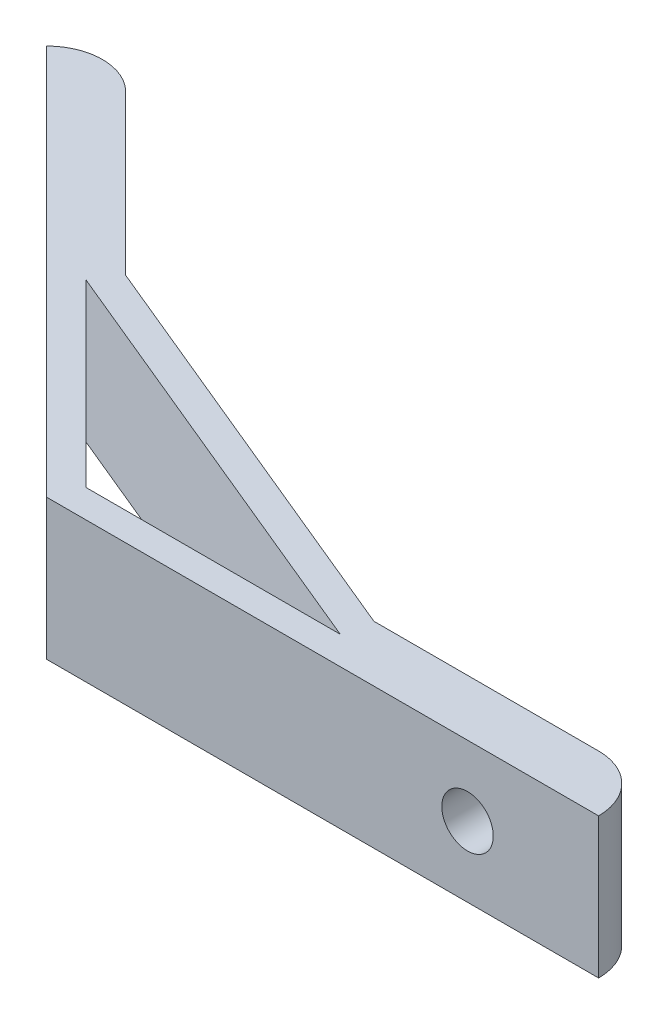
ISO-10303-21;
HEADER;
FILE_DESCRIPTION(('STEP AP214'),'2;1');
FILE_NAME('part.step','',(''),(''),'','','');
FILE_SCHEMA(('AUTOMOTIVE_DESIGN { 1 0 10303 214 1 1 1 1 }'));
ENDSEC;
DATA;
#1=APPLICATION_CONTEXT('core data for automotive mechanical design processes');
#2=APPLICATION_PROTOCOL_DEFINITION('international standard','automotive_design',2000,#1);
#3=PRODUCT_CONTEXT('',#1,'mechanical');
#4=PRODUCT('Part','Part','',(#3));
#5=PRODUCT_RELATED_PRODUCT_CATEGORY('part','',(#4));
#6=PRODUCT_DEFINITION_FORMATION('','',#4);
#7=PRODUCT_DEFINITION_CONTEXT('part definition',#1,'design');
#8=PRODUCT_DEFINITION('design','',#6,#7);
#9=PRODUCT_DEFINITION_SHAPE('','',#8);
#10=(LENGTH_UNIT() NAMED_UNIT(*) SI_UNIT(.MILLI.,.METRE.));
#11=(NAMED_UNIT(*) PLANE_ANGLE_UNIT() SI_UNIT($,.RADIAN.));
#12=(NAMED_UNIT(*) SI_UNIT($,.STERADIAN.) SOLID_ANGLE_UNIT());
#13=UNCERTAINTY_MEASURE_WITH_UNIT(LENGTH_MEASURE(1.E-05),#10,'distance_accuracy_value','');
#14=(GEOMETRIC_REPRESENTATION_CONTEXT(3) GLOBAL_UNCERTAINTY_ASSIGNED_CONTEXT((#13)) GLOBAL_UNIT_ASSIGNED_CONTEXT((#10,
#11,#12)) REPRESENTATION_CONTEXT('',''));
#15=CARTESIAN_POINT('',(0.,0.,0.));
#16=DIRECTION('',(0.,0.,1.));
#17=DIRECTION('',(1.,0.,0.));
#18=AXIS2_PLACEMENT_3D('',#15,#16,#17);
#19=CARTESIAN_POINT('',(-30.,15.,-6.));
#20=DIRECTION('',(0.,0.,1.));
#21=DIRECTION('',(1.,0.,0.));
#22=AXIS2_PLACEMENT_3D('',#19,#20,#21);
#23=PLANE('',#22);
#24=CARTESIAN_POINT('',(-14.,7.5,-6.));
#25=DIRECTION('',(0.,0.,-1.));
#26=DIRECTION('',(-1.,0.,0.));
#27=AXIS2_PLACEMENT_3D('',#24,#25,#26);
#28=CIRCLE('',#27,2.75);
#29=CARTESIAN_POINT('',(-16.75,7.5,-6.));
#30=VERTEX_POINT('',#29);
#31=EDGE_CURVE('E140',#30,#30,#28,.T.);
#32=ORIENTED_EDGE('',*,*,#31,.F.);
#33=EDGE_LOOP('',(#32));
#34=FACE_BOUND('',#33,.T.);
#35=DIRECTION('',(-1.,0.,0.));
#36=VECTOR('',#35,1.);
#37=CARTESIAN_POINT('',(-30.,15.,-6.));
#38=LINE('',#37,#36);
#39=CARTESIAN_POINT('',(-6.,15.,-6.));
#40=VERTEX_POINT('',#39);
#41=CARTESIAN_POINT('',(-30.,15.,-6.));
#42=VERTEX_POINT('',#41);
#43=EDGE_CURVE('E151',#40,#42,#38,.T.);
#44=ORIENTED_EDGE('',*,*,#43,.F.);
#45=DIRECTION('',(0.,-1.,0.));
#46=VECTOR('',#45,1.);
#47=CARTESIAN_POINT('',(-6.,15.,-6.));
#48=LINE('',#47,#46);
#49=CARTESIAN_POINT('',(-6.,0.,-6.));
#50=VERTEX_POINT('',#49);
#51=EDGE_CURVE('E11',#40,#50,#48,.T.);
#52=ORIENTED_EDGE('',*,*,#51,.T.);
#53=DIRECTION('',(-1.,0.,0.));
#54=VECTOR('',#53,1.);
#55=CARTESIAN_POINT('',(-30.,0.,-6.));
#56=LINE('',#55,#54);
#57=CARTESIAN_POINT('',(-30.,0.,-6.));
#58=VERTEX_POINT('',#57);
#59=EDGE_CURVE('E149',#50,#58,#56,.T.);
#60=ORIENTED_EDGE('',*,*,#59,.T.);
#61=DIRECTION('',(0.,-1.,0.));
#62=VECTOR('',#61,1.);
#63=CARTESIAN_POINT('',(-30.,15.,-6.));
#64=LINE('',#63,#62);
#65=EDGE_CURVE('E185',#42,#58,#64,.T.);
#66=ORIENTED_EDGE('',*,*,#65,.F.);
#67=EDGE_LOOP('',(#44,#52,#60,#66));
#68=FACE_BOUND('',#67,.T.);
#69=ADVANCED_FACE('F41',(#34,#68),#23,.F.);
#70=CARTESIAN_POINT('',(-75.2634559672905,15.,-24.7487373415292));
#71=DIRECTION('',(-0.382683432365091,0.,0.923879532511287));
#72=DIRECTION('',(0.923879532511287,0.,0.382683432365091));
#73=AXIS2_PLACEMENT_3D('',#70,#71,#72);
#74=PLANE('',#73);
#75=DIRECTION('',(-0.923879532511286,0.,-0.382683432365091));
#76=VECTOR('',#75,1.);
#77=CARTESIAN_POINT('',(-75.2634559672905,0.,-24.7487373415292));
#78=LINE('',#77,#76);
#79=CARTESIAN_POINT('',(-75.2634559672905,0.,-24.7487373415292));
#80=VERTEX_POINT('',#79);
#81=EDGE_CURVE('E165',#58,#80,#78,.T.);
#82=ORIENTED_EDGE('',*,*,#81,.T.);
#83=DIRECTION('',(0.,-1.,0.));
#84=VECTOR('',#83,1.);
#85=CARTESIAN_POINT('',(-75.2634559672905,15.,-24.7487373415292));
#86=LINE('',#85,#84);
#87=CARTESIAN_POINT('',(-75.2634559672905,15.,-24.7487373415292));
#88=VERTEX_POINT('',#87);
#89=EDGE_CURVE('E182',#88,#80,#86,.T.);
#90=ORIENTED_EDGE('',*,*,#89,.F.);
#91=DIRECTION('',(-0.923879532511286,0.,-0.382683432365091));
#92=VECTOR('',#91,1.);
#93=CARTESIAN_POINT('',(-75.2634559672905,15.,-24.7487373415292));
#94=LINE('',#93,#92);
#95=EDGE_CURVE('E153',#42,#88,#94,.T.);
#96=ORIENTED_EDGE('',*,*,#95,.F.);
#97=ORIENTED_EDGE('',*,*,#65,.T.);
#98=EDGE_LOOP('',(#82,#90,#96,#97));
#99=FACE_BOUND('',#98,.T.);
#100=ADVANCED_FACE('F218',(#99),#74,.F.);
#101=CARTESIAN_POINT('',(-96.4766594028869,15.,-45.9619407771256));
#102=DIRECTION('',(-0.707106781186549,0.,0.707106781186546));
#103=DIRECTION('',(0.707106781186546,0.,0.707106781186549));
#104=AXIS2_PLACEMENT_3D('',#101,#102,#103);
#105=PLANE('',#104);
#106=CARTESIAN_POINT('',(-86.5771644662753,7.5,-36.062445840514));
#107=DIRECTION('',(0.707106781186549,0.,-0.707106781186546));
#108=DIRECTION('',(-0.707106781186546,0.,-0.707106781186549));
#109=AXIS2_PLACEMENT_3D('',#106,#107,#108);
#110=CIRCLE('',#109,2.75000000000002);
#111=CARTESIAN_POINT('',(-88.5217081145383,7.5,-38.006989488777));
#112=VERTEX_POINT('',#111);
#113=EDGE_CURVE('E278',#112,#112,#110,.T.);
#114=ORIENTED_EDGE('',*,*,#113,.F.);
#115=EDGE_LOOP('',(#114));
#116=FACE_BOUND('',#115,.T.);
#117=DIRECTION('',(-0.707106781186546,0.,-0.707106781186548));
#118=VECTOR('',#117,1.);
#119=CARTESIAN_POINT('',(-96.4766594028869,0.,-45.9619407771256));
#120=LINE('',#119,#118);
#121=CARTESIAN_POINT('',(-92.2340187157677,0.,-41.7193000900063));
#122=VERTEX_POINT('',#121);
#123=EDGE_CURVE('E167',#80,#122,#120,.T.);
#124=ORIENTED_EDGE('',*,*,#123,.T.);
#125=DIRECTION('',(0.,-1.,0.));
#126=VECTOR('',#125,1.);
#127=CARTESIAN_POINT('',(-92.2340187157677,15.,-41.7193000900063));
#128=LINE('',#127,#126);
#129=CARTESIAN_POINT('',(-92.2340187157677,15.,-41.7193000900063));
#130=VERTEX_POINT('',#129);
#131=EDGE_CURVE('E192',#122,#130,#128,.F.);
#132=ORIENTED_EDGE('',*,*,#131,.T.);
#133=DIRECTION('',(-0.707106781186546,0.,-0.707106781186548));
#134=VECTOR('',#133,1.);
#135=CARTESIAN_POINT('',(-96.4766594028869,15.,-45.9619407771256));
#136=LINE('',#135,#134);
#137=EDGE_CURVE('E156',#88,#130,#136,.T.);
#138=ORIENTED_EDGE('',*,*,#137,.F.);
#139=ORIENTED_EDGE('',*,*,#89,.T.);
#140=EDGE_LOOP('',(#124,#132,#138,#139));
#141=FACE_BOUND('',#140,.T.);
#142=ADVANCED_FACE('F214',(#116,#141),#105,.F.);
#143=CARTESIAN_POINT('',(-59.,15.,0.));
#144=DIRECTION('',(0.707106781186549,0.,-0.707106781186547));
#145=DIRECTION('',(-0.707106781186547,0.,-0.707106781186549));
#146=AXIS2_PLACEMENT_3D('',#143,#144,#145);
#147=PLANE('',#146);
#148=CARTESIAN_POINT('',(-90.8198051533946,7.5,-31.8198051533947));
#149=DIRECTION('',(0.707106781186549,0.,-0.707106781186547));
#150=DIRECTION('',(-0.707106781186547,0.,-0.707106781186549));
#151=AXIS2_PLACEMENT_3D('',#148,#149,#150);
#152=CIRCLE('',#151,2.75000000000002);
#153=CARTESIAN_POINT('',(-92.7643488016576,7.5,-33.7643488016577));
#154=VERTEX_POINT('',#153);
#155=EDGE_CURVE('E45',#154,#154,#152,.T.);
#156=ORIENTED_EDGE('',*,*,#155,.T.);
#157=EDGE_LOOP('',(#156));
#158=FACE_BOUND('',#157,.T.);
#159=DIRECTION('',(0.707106781186547,0.,0.707106781186549));
#160=VECTOR('',#159,1.);
#161=CARTESIAN_POINT('',(-59.,0.,0.));
#162=LINE('',#161,#160);
#163=CARTESIAN_POINT('',(-100.719300090006,0.,-41.7193000900064));
#164=VERTEX_POINT('',#163);
#165=CARTESIAN_POINT('',(-59.,0.,0.));
#166=VERTEX_POINT('',#165);
#167=EDGE_CURVE('E170',#164,#166,#162,.T.);
#168=ORIENTED_EDGE('',*,*,#167,.T.);
#169=DIRECTION('',(0.,-1.,0.));
#170=VECTOR('',#169,1.);
#171=CARTESIAN_POINT('',(-59.,15.,0.));
#172=LINE('',#171,#170);
#173=CARTESIAN_POINT('',(-59.,15.,0.));
#174=VERTEX_POINT('',#173);
#175=EDGE_CURVE('E176',#174,#166,#172,.T.);
#176=ORIENTED_EDGE('',*,*,#175,.F.);
#177=DIRECTION('',(0.707106781186547,0.,0.707106781186549));
#178=VECTOR('',#177,1.);
#179=CARTESIAN_POINT('',(-59.,15.,0.));
#180=LINE('',#179,#178);
#181=CARTESIAN_POINT('',(-100.719300090006,15.,-41.7193000900064));
#182=VERTEX_POINT('',#181);
#183=EDGE_CURVE('E159',#182,#174,#180,.T.);
#184=ORIENTED_EDGE('',*,*,#183,.F.);
#185=DIRECTION('',(0.,-1.,0.));
#186=VECTOR('',#185,1.);
#187=CARTESIAN_POINT('',(-100.719300090006,15.,-41.7193000900064));
#188=LINE('',#187,#186);
#189=EDGE_CURVE('E179',#182,#164,#188,.T.);
#190=ORIENTED_EDGE('',*,*,#189,.T.);
#191=EDGE_LOOP('',(#168,#176,#184,#190));
#192=FACE_BOUND('',#191,.T.);
#193=ADVANCED_FACE('F206',(#158,#192),#147,.F.);
#194=CARTESIAN_POINT('',(0.,15.,0.));
#195=DIRECTION('',(0.,0.,-1.));
#196=DIRECTION('',(-1.,0.,0.));
#197=AXIS2_PLACEMENT_3D('',#194,#195,#196);
#198=PLANE('',#197);
#199=CARTESIAN_POINT('',(-14.,7.5,0.));
#200=DIRECTION('',(0.,0.,-1.));
#201=DIRECTION('',(-1.,0.,0.));
#202=AXIS2_PLACEMENT_3D('',#199,#200,#201);
#203=CIRCLE('',#202,2.75);
#204=CARTESIAN_POINT('',(-16.75,7.5,0.));
#205=VERTEX_POINT('',#204);
#206=EDGE_CURVE('E145',#205,#205,#203,.T.);
#207=ORIENTED_EDGE('',*,*,#206,.T.);
#208=EDGE_LOOP('',(#207));
#209=FACE_BOUND('',#208,.T.);
#210=DIRECTION('',(1.,0.,0.));
#211=VECTOR('',#210,1.);
#212=CARTESIAN_POINT('',(0.,0.,0.));
#213=LINE('',#212,#211);
#214=CARTESIAN_POINT('',(0.,0.,0.));
#215=VERTEX_POINT('',#214);
#216=EDGE_CURVE('E154',#166,#215,#213,.T.);
#217=ORIENTED_EDGE('',*,*,#216,.T.);
#218=DIRECTION('',(0.,-1.,0.));
#219=VECTOR('',#218,1.);
#220=CARTESIAN_POINT('',(0.,15.,0.));
#221=LINE('',#220,#219);
#222=CARTESIAN_POINT('',(0.,15.,0.));
#223=VERTEX_POINT('',#222);
#224=EDGE_CURVE('E163',#223,#215,#221,.T.);
#225=ORIENTED_EDGE('',*,*,#224,.F.);
#226=DIRECTION('',(1.,0.,0.));
#227=VECTOR('',#226,1.);
#228=CARTESIAN_POINT('',(0.,15.,0.));
#229=LINE('',#228,#227);
#230=EDGE_CURVE('E161',#174,#223,#229,.T.);
#231=ORIENTED_EDGE('',*,*,#230,.F.);
#232=ORIENTED_EDGE('',*,*,#175,.T.);
#233=EDGE_LOOP('',(#217,#225,#231,#232));
#234=FACE_BOUND('',#233,.T.);
#235=ADVANCED_FACE('F228',(#209,#234),#198,.F.);
#236=CARTESIAN_POINT('',(0.,15.,0.));
#237=DIRECTION('',(0.,-1.,0.));
#238=DIRECTION('',(0.,0.,-1.));
#239=AXIS2_PLACEMENT_3D('',#236,#237,#238);
#240=PLANE('',#239);
#241=DIRECTION('',(1.,0.,0.));
#242=VECTOR('',#241,1.);
#243=CARTESIAN_POINT('',(-30.596737102139,15.,-3.));
#244=LINE('',#243,#242);
#245=CARTESIAN_POINT('',(-57.7573593128806,15.,-3.));
#246=VERTEX_POINT('',#245);
#247=CARTESIAN_POINT('',(-30.596737102139,15.,-3.));
#248=VERTEX_POINT('',#247);
#249=EDGE_CURVE('E137',#246,#248,#244,.T.);
#250=ORIENTED_EDGE('',*,*,#249,.F.);
#251=DIRECTION('',(0.707106781186548,0.,0.707106781186547));
#252=VECTOR('',#251,1.);
#253=CARTESIAN_POINT('',(-57.7573593128806,15.,-3.));
#254=LINE('',#253,#252);
#255=CARTESIAN_POINT('',(-76.962819459342,15.,-22.2054601464614));
#256=VERTEX_POINT('',#255);
#257=EDGE_CURVE('E57',#256,#246,#254,.T.);
#258=ORIENTED_EDGE('',*,*,#257,.F.);
#259=DIRECTION('',(-0.923879532511286,0.,-0.38268343236509));
#260=VECTOR('',#259,1.);
#261=CARTESIAN_POINT('',(-76.962819459342,15.,-22.2054601464614));
#262=LINE('',#261,#260);
#263=EDGE_CURVE('E134',#248,#256,#262,.T.);
#264=ORIENTED_EDGE('',*,*,#263,.F.);
#265=EDGE_LOOP('',(#250,#258,#264));
#266=FACE_BOUND('',#265,.T.);
#267=ORIENTED_EDGE('',*,*,#137,.T.);
#268=CARTESIAN_POINT('',(-96.476659402887,15.,-37.4766594028871));
#269=DIRECTION('',(0.,-1.,0.));
#270=DIRECTION('',(0.,0.,-1.));
#271=AXIS2_PLACEMENT_3D('',#268,#269,#270);
#272=CIRCLE('',#271,6.);
#273=EDGE_CURVE('E50',#130,#182,#272,.F.);
#274=ORIENTED_EDGE('',*,*,#273,.T.);
#275=ORIENTED_EDGE('',*,*,#183,.T.);
#276=ORIENTED_EDGE('',*,*,#230,.T.);
#277=CARTESIAN_POINT('',(-6.,15.,0.));
#278=DIRECTION('',(0.,-1.,0.));
#279=DIRECTION('',(0.,0.,-1.));
#280=AXIS2_PLACEMENT_3D('',#277,#278,#279);
#281=CIRCLE('',#280,6.);
#282=EDGE_CURVE('E194',#223,#40,#281,.F.);
#283=ORIENTED_EDGE('',*,*,#282,.T.);
#284=ORIENTED_EDGE('',*,*,#43,.T.);
#285=ORIENTED_EDGE('',*,*,#95,.T.);
#286=EDGE_LOOP('',(#267,#274,#275,#276,#283,#284,#285));
#287=FACE_BOUND('',#286,.T.);
#288=ADVANCED_FACE('F199',(#266,#287),#240,.F.);
#289=CARTESIAN_POINT('',(0.,0.,0.));
#290=DIRECTION('',(0.,-1.,0.));
#291=DIRECTION('',(0.,0.,-1.));
#292=AXIS2_PLACEMENT_3D('',#289,#290,#291);
#293=PLANE('',#292);
#294=DIRECTION('',(0.707106781186548,0.,0.707106781186547));
#295=VECTOR('',#294,1.);
#296=CARTESIAN_POINT('',(-57.7573593128806,0.,-3.));
#297=LINE('',#296,#295);
#298=CARTESIAN_POINT('',(-76.962819459342,0.,-22.2054601464614));
#299=VERTEX_POINT('',#298);
#300=CARTESIAN_POINT('',(-57.7573593128806,0.,-3.));
#301=VERTEX_POINT('',#300);
#302=EDGE_CURVE('E121',#299,#301,#297,.T.);
#303=ORIENTED_EDGE('',*,*,#302,.T.);
#304=DIRECTION('',(1.,0.,0.));
#305=VECTOR('',#304,1.);
#306=CARTESIAN_POINT('',(-30.596737102139,0.,-3.));
#307=LINE('',#306,#305);
#308=CARTESIAN_POINT('',(-30.596737102139,0.,-3.));
#309=VERTEX_POINT('',#308);
#310=EDGE_CURVE('E128',#301,#309,#307,.T.);
#311=ORIENTED_EDGE('',*,*,#310,.T.);
#312=DIRECTION('',(-0.923879532511286,0.,-0.38268343236509));
#313=VECTOR('',#312,1.);
#314=CARTESIAN_POINT('',(-76.962819459342,0.,-22.2054601464614));
#315=LINE('',#314,#313);
#316=EDGE_CURVE('E65',#309,#299,#315,.T.);
#317=ORIENTED_EDGE('',*,*,#316,.T.);
#318=EDGE_LOOP('',(#303,#311,#317));
#319=FACE_BOUND('',#318,.T.);
#320=ORIENTED_EDGE('',*,*,#167,.F.);
#321=CARTESIAN_POINT('',(-96.476659402887,0.,-37.4766594028871));
#322=DIRECTION('',(0.,-1.,0.));
#323=DIRECTION('',(0.,0.,-1.));
#324=AXIS2_PLACEMENT_3D('',#321,#322,#323);
#325=CIRCLE('',#324,6.);
#326=EDGE_CURVE('E190',#164,#122,#325,.T.);
#327=ORIENTED_EDGE('',*,*,#326,.T.);
#328=ORIENTED_EDGE('',*,*,#123,.F.);
#329=ORIENTED_EDGE('',*,*,#81,.F.);
#330=ORIENTED_EDGE('',*,*,#59,.F.);
#331=CARTESIAN_POINT('',(-6.,0.,0.));
#332=DIRECTION('',(0.,-1.,0.));
#333=DIRECTION('',(0.,0.,-1.));
#334=AXIS2_PLACEMENT_3D('',#331,#332,#333);
#335=CIRCLE('',#334,6.);
#336=EDGE_CURVE('E188',#50,#215,#335,.T.);
#337=ORIENTED_EDGE('',*,*,#336,.T.);
#338=ORIENTED_EDGE('',*,*,#216,.F.);
#339=EDGE_LOOP('',(#320,#327,#328,#329,#330,#337,#338));
#340=FACE_BOUND('',#339,.T.);
#341=ADVANCED_FACE('F132',(#319,#340),#293,.T.);
#342=CARTESIAN_POINT('',(-96.476659402887,15.,-37.4766594028871));
#343=DIRECTION('',(0.,-1.,0.));
#344=DIRECTION('',(0.,0.,-1.));
#345=AXIS2_PLACEMENT_3D('',#342,#343,#344);
#346=CYLINDRICAL_SURFACE('',#345,6.);
#347=ORIENTED_EDGE('',*,*,#273,.F.);
#348=ORIENTED_EDGE('',*,*,#131,.F.);
#349=ORIENTED_EDGE('',*,*,#326,.F.);
#350=ORIENTED_EDGE('',*,*,#189,.F.);
#351=EDGE_LOOP('',(#347,#348,#349,#350));
#352=FACE_BOUND('',#351,.T.);
#353=ADVANCED_FACE('F209',(#352),#346,.T.);
#354=CARTESIAN_POINT('',(-6.,15.,0.));
#355=DIRECTION('',(0.,-1.,0.));
#356=DIRECTION('',(0.,0.,-1.));
#357=AXIS2_PLACEMENT_3D('',#354,#355,#356);
#358=CYLINDRICAL_SURFACE('',#357,6.);
#359=ORIENTED_EDGE('',*,*,#282,.F.);
#360=ORIENTED_EDGE('',*,*,#224,.T.);
#361=ORIENTED_EDGE('',*,*,#336,.F.);
#362=ORIENTED_EDGE('',*,*,#51,.F.);
#363=EDGE_LOOP('',(#359,#360,#361,#362));
#364=FACE_BOUND('',#363,.T.);
#365=ADVANCED_FACE('F43',(#364),#358,.T.);
#366=CARTESIAN_POINT('',(-57.7573593128806,0.,-3.));
#367=DIRECTION('',(-0.707106781186547,0.,0.707106781186548));
#368=DIRECTION('',(0.707106781186548,0.,0.707106781186547));
#369=AXIS2_PLACEMENT_3D('',#366,#367,#368);
#370=PLANE('',#369);
#371=ORIENTED_EDGE('',*,*,#257,.T.);
#372=DIRECTION('',(0.,1.,0.));
#373=VECTOR('',#372,1.);
#374=CARTESIAN_POINT('',(-57.7573593128806,0.,-3.));
#375=LINE('',#374,#373);
#376=EDGE_CURVE('E117',#301,#246,#375,.T.);
#377=ORIENTED_EDGE('',*,*,#376,.F.);
#378=ORIENTED_EDGE('',*,*,#302,.F.);
#379=DIRECTION('',(0.,1.,0.));
#380=VECTOR('',#379,1.);
#381=CARTESIAN_POINT('',(-76.962819459342,0.,-22.2054601464614));
#382=LINE('',#381,#380);
#383=EDGE_CURVE('E147',#299,#256,#382,.T.);
#384=ORIENTED_EDGE('',*,*,#383,.T.);
#385=EDGE_LOOP('',(#371,#377,#378,#384));
#386=FACE_BOUND('',#385,.T.);
#387=ADVANCED_FACE('F119',(#386),#370,.F.);
#388=CARTESIAN_POINT('',(-76.962819459342,0.,-22.2054601464614));
#389=DIRECTION('',(0.38268343236509,0.,-0.923879532511286));
#390=DIRECTION('',(-0.923879532511287,0.,-0.382683432365091));
#391=AXIS2_PLACEMENT_3D('',#388,#389,#390);
#392=PLANE('',#391);
#393=ORIENTED_EDGE('',*,*,#263,.T.);
#394=ORIENTED_EDGE('',*,*,#383,.F.);
#395=ORIENTED_EDGE('',*,*,#316,.F.);
#396=DIRECTION('',(0.,1.,0.));
#397=VECTOR('',#396,1.);
#398=CARTESIAN_POINT('',(-30.596737102139,0.,-3.));
#399=LINE('',#398,#397);
#400=EDGE_CURVE('E125',#309,#248,#399,.T.);
#401=ORIENTED_EDGE('',*,*,#400,.T.);
#402=EDGE_LOOP('',(#393,#394,#395,#401));
#403=FACE_BOUND('',#402,.T.);
#404=ADVANCED_FACE('F261',(#403),#392,.F.);
#405=CARTESIAN_POINT('',(-30.596737102139,0.,-3.));
#406=DIRECTION('',(0.,0.,1.));
#407=DIRECTION('',(1.,0.,0.));
#408=AXIS2_PLACEMENT_3D('',#405,#406,#407);
#409=PLANE('',#408);
#410=ORIENTED_EDGE('',*,*,#249,.T.);
#411=ORIENTED_EDGE('',*,*,#400,.F.);
#412=ORIENTED_EDGE('',*,*,#310,.F.);
#413=ORIENTED_EDGE('',*,*,#376,.T.);
#414=EDGE_LOOP('',(#410,#411,#412,#413));
#415=FACE_BOUND('',#414,.T.);
#416=ADVANCED_FACE('F129',(#415),#409,.F.);
#417=CARTESIAN_POINT('',(-14.,7.5,0.));
#418=DIRECTION('',(0.,0.,-1.));
#419=DIRECTION('',(-1.,0.,0.));
#420=AXIS2_PLACEMENT_3D('',#417,#418,#419);
#421=CYLINDRICAL_SURFACE('',#420,2.75);
#422=ORIENTED_EDGE('',*,*,#206,.F.);
#423=EDGE_LOOP('',(#422));
#424=FACE_BOUND('',#423,.T.);
#425=ORIENTED_EDGE('',*,*,#31,.T.);
#426=EDGE_LOOP('',(#425));
#427=FACE_BOUND('',#426,.T.);
#428=ADVANCED_FACE('F264',(#424,#427),#421,.F.);
#429=CARTESIAN_POINT('',(-111.679455198398,7.5,-10.9601551083916));
#430=DIRECTION('',(0.707106781186549,0.,-0.707106781186546));
#431=DIRECTION('',(-0.707106781186546,0.,-0.707106781186549));
#432=AXIS2_PLACEMENT_3D('',#429,#430,#431);
#433=CYLINDRICAL_SURFACE('',#432,2.75000000000002);
#434=ORIENTED_EDGE('',*,*,#113,.T.);
#435=EDGE_LOOP('',(#434));
#436=FACE_BOUND('',#435,.T.);
#437=ORIENTED_EDGE('',*,*,#155,.F.);
#438=EDGE_LOOP('',(#437));
#439=FACE_BOUND('',#438,.T.);
#440=ADVANCED_FACE('F269',(#436,#439),#433,.F.);
#441=CLOSED_SHELL('',(#69,#100,#142,#193,#235,#288,#341,#353,#365,#387,#404,#416,#428,#440));
#442=MANIFOLD_SOLID_BREP('B2',#441);
#443=ADVANCED_BREP_SHAPE_REPRESENTATION('',(#18,#442),#14);
#444=SHAPE_DEFINITION_REPRESENTATION(#9,#443);
ENDSEC;
END-ISO-10303-21;
